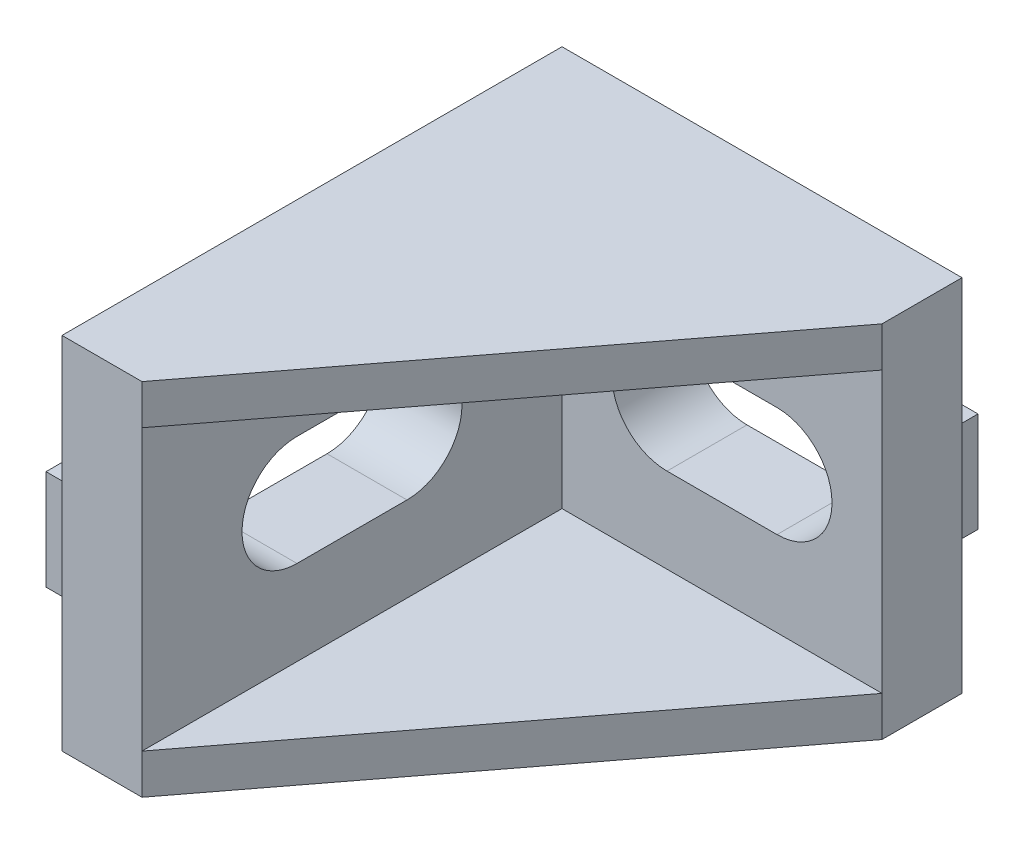
ISO-10303-21;
HEADER;
FILE_DESCRIPTION(('STEP AP214'),'2;1');
FILE_NAME('part.step','',(''),(''),'','','');
FILE_SCHEMA(('AUTOMOTIVE_DESIGN { 1 0 10303 214 1 1 1 1 }'));
ENDSEC;
DATA;
#1=APPLICATION_CONTEXT('core data for automotive mechanical design processes');
#2=APPLICATION_PROTOCOL_DEFINITION('international standard','automotive_design',2000,#1);
#3=PRODUCT_CONTEXT('',#1,'mechanical');
#4=PRODUCT('Part','Part','',(#3));
#5=PRODUCT_RELATED_PRODUCT_CATEGORY('part','',(#4));
#6=PRODUCT_DEFINITION_FORMATION('','',#4);
#7=PRODUCT_DEFINITION_CONTEXT('part definition',#1,'design');
#8=PRODUCT_DEFINITION('design','',#6,#7);
#9=PRODUCT_DEFINITION_SHAPE('','',#8);
#10=(LENGTH_UNIT() NAMED_UNIT(*) SI_UNIT(.MILLI.,.METRE.));
#11=(NAMED_UNIT(*) PLANE_ANGLE_UNIT() SI_UNIT($,.RADIAN.));
#12=(NAMED_UNIT(*) SI_UNIT($,.STERADIAN.) SOLID_ANGLE_UNIT());
#13=UNCERTAINTY_MEASURE_WITH_UNIT(LENGTH_MEASURE(1.E-05),#10,'distance_accuracy_value','');
#14=(GEOMETRIC_REPRESENTATION_CONTEXT(3) GLOBAL_UNCERTAINTY_ASSIGNED_CONTEXT((#13)) GLOBAL_UNIT_ASSIGNED_CONTEXT((#10,
#11,#12)) REPRESENTATION_CONTEXT('',''));
#15=CARTESIAN_POINT('',(0.,0.,0.));
#16=DIRECTION('',(0.,0.,1.));
#17=DIRECTION('',(1.,0.,0.));
#18=AXIS2_PLACEMENT_3D('',#15,#16,#17);
#19=CARTESIAN_POINT('',(-10.,9.,25.));
#20=DIRECTION('',(1.,0.,0.));
#21=DIRECTION('',(0.,0.,-1.));
#22=AXIS2_PLACEMENT_3D('',#19,#20,#21);
#23=PLANE('',#22);
#24=DIRECTION('',(0.,-1.,0.));
#25=VECTOR('',#24,1.);
#26=CARTESIAN_POINT('',(-10.,2.5,0.200000000000001));
#27=LINE('',#26,#25);
#28=CARTESIAN_POINT('',(-10.,2.5,0.200000000000001));
#29=VERTEX_POINT('',#28);
#30=CARTESIAN_POINT('',(-10.,-2.5,0.200000000000002));
#31=VERTEX_POINT('',#30);
#32=EDGE_CURVE('E254',#29,#31,#27,.T.);
#33=ORIENTED_EDGE('',*,*,#32,.F.);
#34=DIRECTION('',(0.,0.,-1.));
#35=VECTOR('',#34,1.);
#36=CARTESIAN_POINT('',(-10.,2.5,0.200000000000001));
#37=LINE('',#36,#35);
#38=CARTESIAN_POINT('',(-10.,2.5,2.2));
#39=VERTEX_POINT('',#38);
#40=EDGE_CURVE('E297',#39,#29,#37,.T.);
#41=ORIENTED_EDGE('',*,*,#40,.F.);
#42=DIRECTION('',(0.,1.,0.));
#43=VECTOR('',#42,1.);
#44=CARTESIAN_POINT('',(-10.,2.5,2.2));
#45=LINE('',#44,#43);
#46=CARTESIAN_POINT('',(-10.,-2.5,2.2));
#47=VERTEX_POINT('',#46);
#48=EDGE_CURVE('E314',#47,#39,#45,.T.);
#49=ORIENTED_EDGE('',*,*,#48,.F.);
#50=DIRECTION('',(0.,0.,1.));
#51=VECTOR('',#50,1.);
#52=CARTESIAN_POINT('',(-10.,-2.5,0.200000000000001));
#53=LINE('',#52,#51);
#54=EDGE_CURVE('E310',#31,#47,#53,.T.);
#55=ORIENTED_EDGE('',*,*,#54,.F.);
#56=EDGE_LOOP('',(#33,#41,#49,#55));
#57=FACE_BOUND('',#56,.T.);
#58=DIRECTION('',(0.,0.,1.));
#59=VECTOR('',#58,1.);
#60=CARTESIAN_POINT('',(-10.,2.75,17.25));
#61=LINE('',#60,#59);
#62=CARTESIAN_POINT('',(-10.,2.75,11.75));
#63=VERTEX_POINT('',#62);
#64=CARTESIAN_POINT('',(-10.,2.75,17.25));
#65=VERTEX_POINT('',#64);
#66=EDGE_CURVE('E440',#63,#65,#61,.T.);
#67=ORIENTED_EDGE('',*,*,#66,.T.);
#68=CARTESIAN_POINT('',(-10.,0.,17.25));
#69=DIRECTION('',(1.,0.,0.));
#70=DIRECTION('',(0.,1.,0.));
#71=AXIS2_PLACEMENT_3D('',#68,#69,#70);
#72=CIRCLE('',#71,2.75);
#73=CARTESIAN_POINT('',(-10.,-2.75,17.25));
#74=VERTEX_POINT('',#73);
#75=EDGE_CURVE('E427',#65,#74,#72,.T.);
#76=ORIENTED_EDGE('',*,*,#75,.T.);
#77=DIRECTION('',(0.,0.,-1.));
#78=VECTOR('',#77,1.);
#79=CARTESIAN_POINT('',(-10.,-2.75,17.25));
#80=LINE('',#79,#78);
#81=CARTESIAN_POINT('',(-10.,-2.75,11.75));
#82=VERTEX_POINT('',#81);
#83=EDGE_CURVE('E431',#74,#82,#80,.T.);
#84=ORIENTED_EDGE('',*,*,#83,.T.);
#85=CARTESIAN_POINT('',(-10.,0.,11.75));
#86=DIRECTION('',(1.,0.,0.));
#87=DIRECTION('',(0.,1.,0.));
#88=AXIS2_PLACEMENT_3D('',#85,#86,#87);
#89=CIRCLE('',#88,2.75);
#90=EDGE_CURVE('E436',#82,#63,#89,.T.);
#91=ORIENTED_EDGE('',*,*,#90,.T.);
#92=EDGE_LOOP('',(#67,#76,#84,#91));
#93=FACE_BOUND('',#92,.T.);
#94=DIRECTION('',(0.,-1.,0.));
#95=VECTOR('',#94,1.);
#96=CARTESIAN_POINT('',(-10.,9.,0.));
#97=LINE('',#96,#95);
#98=CARTESIAN_POINT('',(-10.,9.,0.));
#99=VERTEX_POINT('',#98);
#100=CARTESIAN_POINT('',(-10.,-9.,0.));
#101=VERTEX_POINT('',#100);
#102=EDGE_CURVE('E585',#99,#101,#97,.T.);
#103=ORIENTED_EDGE('',*,*,#102,.T.);
#104=DIRECTION('',(0.,0.,-1.));
#105=VECTOR('',#104,1.);
#106=CARTESIAN_POINT('',(-10.,-9.,25.));
#107=LINE('',#106,#105);
#108=CARTESIAN_POINT('',(-10.,-9.,25.));
#109=VERTEX_POINT('',#108);
#110=EDGE_CURVE('E593',#109,#101,#107,.T.);
#111=ORIENTED_EDGE('',*,*,#110,.F.);
#112=DIRECTION('',(0.,-1.,0.));
#113=VECTOR('',#112,1.);
#114=CARTESIAN_POINT('',(-10.,9.,25.));
#115=LINE('',#114,#113);
#116=CARTESIAN_POINT('',(-10.,9.,25.));
#117=VERTEX_POINT('',#116);
#118=EDGE_CURVE('E570',#117,#109,#115,.T.);
#119=ORIENTED_EDGE('',*,*,#118,.F.);
#120=DIRECTION('',(0.,0.,-1.));
#121=VECTOR('',#120,1.);
#122=CARTESIAN_POINT('',(-10.,9.,25.));
#123=LINE('',#122,#121);
#124=EDGE_CURVE('E51',#117,#99,#123,.T.);
#125=ORIENTED_EDGE('',*,*,#124,.T.);
#126=EDGE_LOOP('',(#103,#111,#119,#125));
#127=FACE_BOUND('',#126,.T.);
#128=DIRECTION('',(0.,-1.,0.));
#129=VECTOR('',#128,1.);
#130=CARTESIAN_POINT('',(-10.,2.5,22.8));
#131=LINE('',#130,#129);
#132=CARTESIAN_POINT('',(-10.,2.5,22.8));
#133=VERTEX_POINT('',#132);
#134=CARTESIAN_POINT('',(-10.,-2.5,22.8));
#135=VERTEX_POINT('',#134);
#136=EDGE_CURVE('E247',#133,#135,#131,.T.);
#137=ORIENTED_EDGE('',*,*,#136,.F.);
#138=DIRECTION('',(0.,0.,-1.));
#139=VECTOR('',#138,1.);
#140=CARTESIAN_POINT('',(-10.,2.5,22.8));
#141=LINE('',#140,#139);
#142=CARTESIAN_POINT('',(-10.,2.5,24.8));
#143=VERTEX_POINT('',#142);
#144=EDGE_CURVE('E249',#143,#133,#141,.T.);
#145=ORIENTED_EDGE('',*,*,#144,.F.);
#146=DIRECTION('',(0.,1.,0.));
#147=VECTOR('',#146,1.);
#148=CARTESIAN_POINT('',(-10.,2.5,24.8));
#149=LINE('',#148,#147);
#150=CARTESIAN_POINT('',(-10.,-2.5,24.8));
#151=VERTEX_POINT('',#150);
#152=EDGE_CURVE('E63',#151,#143,#149,.T.);
#153=ORIENTED_EDGE('',*,*,#152,.F.);
#154=DIRECTION('',(0.,0.,1.));
#155=VECTOR('',#154,1.);
#156=CARTESIAN_POINT('',(-10.,-2.5,22.8));
#157=LINE('',#156,#155);
#158=EDGE_CURVE('E58',#135,#151,#157,.T.);
#159=ORIENTED_EDGE('',*,*,#158,.F.);
#160=EDGE_LOOP('',(#137,#145,#153,#159));
#161=FACE_BOUND('',#160,.T.);
#162=ADVANCED_FACE('F42',(#57,#93,#127,#161),#23,.F.);
#163=CARTESIAN_POINT('',(0.,0.,0.));
#164=DIRECTION('',(0.,0.,1.));
#165=DIRECTION('',(1.,0.,0.));
#166=AXIS2_PLACEMENT_3D('',#163,#164,#165);
#167=PLANE('',#166);
#168=DIRECTION('',(0.,-1.,0.));
#169=VECTOR('',#168,1.);
#170=CARTESIAN_POINT('',(9.8,2.5,0.));
#171=LINE('',#170,#169);
#172=CARTESIAN_POINT('',(9.8,2.5,0.));
#173=VERTEX_POINT('',#172);
#174=CARTESIAN_POINT('',(9.8,-2.5,0.));
#175=VERTEX_POINT('',#174);
#176=EDGE_CURVE('E370',#173,#175,#171,.T.);
#177=ORIENTED_EDGE('',*,*,#176,.F.);
#178=DIRECTION('',(1.,0.,0.));
#179=VECTOR('',#178,1.);
#180=CARTESIAN_POINT('',(9.8,2.5,0.));
#181=LINE('',#180,#179);
#182=CARTESIAN_POINT('',(7.8,2.5,0.));
#183=VERTEX_POINT('',#182);
#184=EDGE_CURVE('E387',#183,#173,#181,.T.);
#185=ORIENTED_EDGE('',*,*,#184,.F.);
#186=DIRECTION('',(0.,1.,0.));
#187=VECTOR('',#186,1.);
#188=CARTESIAN_POINT('',(7.8,2.5,0.));
#189=LINE('',#188,#187);
#190=CARTESIAN_POINT('',(7.8,-2.5,0.));
#191=VERTEX_POINT('',#190);
#192=EDGE_CURVE('E404',#191,#183,#189,.T.);
#193=ORIENTED_EDGE('',*,*,#192,.F.);
#194=DIRECTION('',(-1.,0.,0.));
#195=VECTOR('',#194,1.);
#196=CARTESIAN_POINT('',(9.8,-2.5,0.));
#197=LINE('',#196,#195);
#198=EDGE_CURVE('E400',#175,#191,#197,.T.);
#199=ORIENTED_EDGE('',*,*,#198,.F.);
#200=EDGE_LOOP('',(#177,#185,#193,#199));
#201=FACE_BOUND('',#200,.T.);
#202=DIRECTION('',(-1.,0.,0.));
#203=VECTOR('',#202,1.);
#204=CARTESIAN_POINT('',(-0.749999999999998,2.75,0.));
#205=LINE('',#204,#203);
#206=CARTESIAN_POINT('',(4.75,2.75,0.));
#207=VERTEX_POINT('',#206);
#208=CARTESIAN_POINT('',(-0.749999999999998,2.75,0.));
#209=VERTEX_POINT('',#208);
#210=EDGE_CURVE('E484',#207,#209,#205,.T.);
#211=ORIENTED_EDGE('',*,*,#210,.T.);
#212=CARTESIAN_POINT('',(-0.749999999999998,0.,0.));
#213=DIRECTION('',(0.,0.,1.));
#214=DIRECTION('',(1.,0.,0.));
#215=AXIS2_PLACEMENT_3D('',#212,#213,#214);
#216=CIRCLE('',#215,2.75);
#217=CARTESIAN_POINT('',(-0.749999999999998,-2.75,0.));
#218=VERTEX_POINT('',#217);
#219=EDGE_CURVE('E471',#209,#218,#216,.T.);
#220=ORIENTED_EDGE('',*,*,#219,.T.);
#221=DIRECTION('',(1.,0.,0.));
#222=VECTOR('',#221,1.);
#223=CARTESIAN_POINT('',(-0.749999999999998,-2.75,0.));
#224=LINE('',#223,#222);
#225=CARTESIAN_POINT('',(4.75,-2.75,0.));
#226=VERTEX_POINT('',#225);
#227=EDGE_CURVE('E475',#218,#226,#224,.T.);
#228=ORIENTED_EDGE('',*,*,#227,.T.);
#229=CARTESIAN_POINT('',(4.75,0.,0.));
#230=DIRECTION('',(0.,0.,1.));
#231=DIRECTION('',(1.,0.,0.));
#232=AXIS2_PLACEMENT_3D('',#229,#230,#231);
#233=CIRCLE('',#232,2.75);
#234=EDGE_CURVE('E480',#226,#207,#233,.T.);
#235=ORIENTED_EDGE('',*,*,#234,.T.);
#236=EDGE_LOOP('',(#211,#220,#228,#235));
#237=FACE_BOUND('',#236,.T.);
#238=DIRECTION('',(0.,1.,0.));
#239=VECTOR('',#238,1.);
#240=CARTESIAN_POINT('',(10.,9.,0.));
#241=LINE('',#240,#239);
#242=CARTESIAN_POINT('',(10.,-9.,0.));
#243=VERTEX_POINT('',#242);
#244=CARTESIAN_POINT('',(10.,9.,0.));
#245=VERTEX_POINT('',#244);
#246=EDGE_CURVE('E563',#243,#245,#241,.T.);
#247=ORIENTED_EDGE('',*,*,#246,.F.);
#248=DIRECTION('',(1.,0.,0.));
#249=VECTOR('',#248,1.);
#250=CARTESIAN_POINT('',(-10.,-9.,0.));
#251=LINE('',#250,#249);
#252=EDGE_CURVE('E571',#101,#243,#251,.T.);
#253=ORIENTED_EDGE('',*,*,#252,.F.);
#254=ORIENTED_EDGE('',*,*,#102,.F.);
#255=DIRECTION('',(-1.,0.,0.));
#256=VECTOR('',#255,1.);
#257=CARTESIAN_POINT('',(-10.,9.,0.));
#258=LINE('',#257,#256);
#259=EDGE_CURVE('E582',#245,#99,#258,.T.);
#260=ORIENTED_EDGE('',*,*,#259,.F.);
#261=EDGE_LOOP('',(#247,#253,#254,#260));
#262=FACE_BOUND('',#261,.T.);
#263=DIRECTION('',(0.,1.,0.));
#264=VECTOR('',#263,1.);
#265=CARTESIAN_POINT('',(-9.8,2.5,0.));
#266=LINE('',#265,#264);
#267=CARTESIAN_POINT('',(-9.8,-2.5,0.));
#268=VERTEX_POINT('',#267);
#269=CARTESIAN_POINT('',(-9.8,2.5,0.));
#270=VERTEX_POINT('',#269);
#271=EDGE_CURVE('E366',#268,#270,#266,.T.);
#272=ORIENTED_EDGE('',*,*,#271,.F.);
#273=DIRECTION('',(-1.,0.,0.));
#274=VECTOR('',#273,1.);
#275=CARTESIAN_POINT('',(-9.8,-2.5,0.));
#276=LINE('',#275,#274);
#277=CARTESIAN_POINT('',(-7.8,-2.5,0.));
#278=VERTEX_POINT('',#277);
#279=EDGE_CURVE('E353',#278,#268,#276,.T.);
#280=ORIENTED_EDGE('',*,*,#279,.F.);
#281=DIRECTION('',(0.,-1.,0.));
#282=VECTOR('',#281,1.);
#283=CARTESIAN_POINT('',(-7.8,2.5,0.));
#284=LINE('',#283,#282);
#285=CARTESIAN_POINT('',(-7.8,2.5,0.));
#286=VERTEX_POINT('',#285);
#287=EDGE_CURVE('E357',#286,#278,#284,.T.);
#288=ORIENTED_EDGE('',*,*,#287,.F.);
#289=DIRECTION('',(1.,0.,0.));
#290=VECTOR('',#289,1.);
#291=CARTESIAN_POINT('',(-9.8,2.5,0.));
#292=LINE('',#291,#290);
#293=EDGE_CURVE('E362',#270,#286,#292,.T.);
#294=ORIENTED_EDGE('',*,*,#293,.F.);
#295=EDGE_LOOP('',(#272,#280,#288,#294));
#296=FACE_BOUND('',#295,.T.);
#297=ADVANCED_FACE('F609',(#201,#237,#262,#296),#167,.F.);
#298=CARTESIAN_POINT('',(10.,9.,25.));
#299=DIRECTION('',(-1.,0.,0.));
#300=DIRECTION('',(0.,0.,1.));
#301=AXIS2_PLACEMENT_3D('',#298,#299,#300);
#302=PLANE('',#301);
#303=DIRECTION('',(0.,0.,-1.));
#304=VECTOR('',#303,1.);
#305=CARTESIAN_POINT('',(10.,9.,25.));
#306=LINE('',#305,#304);
#307=CARTESIAN_POINT('',(10.,9.,4.));
#308=VERTEX_POINT('',#307);
#309=EDGE_CURVE('E11',#308,#245,#306,.T.);
#310=ORIENTED_EDGE('',*,*,#309,.F.);
#311=DIRECTION('',(0.,1.,0.));
#312=VECTOR('',#311,1.);
#313=CARTESIAN_POINT('',(10.,-9.,4.));
#314=LINE('',#313,#312);
#315=CARTESIAN_POINT('',(10.,7.,4.));
#316=VERTEX_POINT('',#315);
#317=EDGE_CURVE('E521',#316,#308,#314,.T.);
#318=ORIENTED_EDGE('',*,*,#317,.F.);
#319=DIRECTION('',(0.,1.,0.));
#320=VECTOR('',#319,1.);
#321=CARTESIAN_POINT('',(10.,7.,4.));
#322=LINE('',#321,#320);
#323=CARTESIAN_POINT('',(10.,-7.,4.));
#324=VERTEX_POINT('',#323);
#325=EDGE_CURVE('E539',#324,#316,#322,.T.);
#326=ORIENTED_EDGE('',*,*,#325,.F.);
#327=CARTESIAN_POINT('',(10.,-9.,4.));
#328=VERTEX_POINT('',#327);
#329=EDGE_CURVE('E528',#328,#324,#314,.T.);
#330=ORIENTED_EDGE('',*,*,#329,.F.);
#331=DIRECTION('',(0.,0.,-1.));
#332=VECTOR('',#331,1.);
#333=CARTESIAN_POINT('',(10.,-9.,25.));
#334=LINE('',#333,#332);
#335=EDGE_CURVE('E578',#328,#243,#334,.T.);
#336=ORIENTED_EDGE('',*,*,#335,.T.);
#337=ORIENTED_EDGE('',*,*,#246,.T.);
#338=EDGE_LOOP('',(#310,#318,#326,#330,#336,#337));
#339=FACE_BOUND('',#338,.T.);
#340=ADVANCED_FACE('F44',(#339),#302,.F.);
#341=CARTESIAN_POINT('',(-10.,9.,25.));
#342=DIRECTION('',(0.,-1.,0.));
#343=DIRECTION('',(0.,0.,-1.));
#344=AXIS2_PLACEMENT_3D('',#341,#342,#343);
#345=PLANE('',#344);
#346=DIRECTION('',(-1.,0.,0.));
#347=VECTOR('',#346,1.);
#348=CARTESIAN_POINT('',(-10.,9.,25.));
#349=LINE('',#348,#347);
#350=CARTESIAN_POINT('',(-6.,9.,25.));
#351=VERTEX_POINT('',#350);
#352=EDGE_CURVE('E567',#351,#117,#349,.T.);
#353=ORIENTED_EDGE('',*,*,#352,.F.);
#354=DIRECTION('',(-0.606043215262856,0.,0.795431720032499));
#355=VECTOR('',#354,1.);
#356=CARTESIAN_POINT('',(-6.,9.,25.));
#357=LINE('',#356,#355);
#358=EDGE_CURVE('E505',#308,#351,#357,.T.);
#359=ORIENTED_EDGE('',*,*,#358,.F.);
#360=ORIENTED_EDGE('',*,*,#309,.T.);
#361=ORIENTED_EDGE('',*,*,#259,.T.);
#362=ORIENTED_EDGE('',*,*,#124,.F.);
#363=EDGE_LOOP('',(#353,#359,#360,#361,#362));
#364=FACE_BOUND('',#363,.T.);
#365=ADVANCED_FACE('F620',(#364),#345,.F.);
#366=CARTESIAN_POINT('',(-10.,-9.,25.));
#367=DIRECTION('',(0.,1.,0.));
#368=DIRECTION('',(0.,0.,1.));
#369=AXIS2_PLACEMENT_3D('',#366,#367,#368);
#370=PLANE('',#369);
#371=ORIENTED_EDGE('',*,*,#335,.F.);
#372=DIRECTION('',(-0.606043215262856,0.,0.795431720032499));
#373=VECTOR('',#372,1.);
#374=CARTESIAN_POINT('',(-6.,-9.,25.));
#375=LINE('',#374,#373);
#376=CARTESIAN_POINT('',(-6.,-9.,25.));
#377=VERTEX_POINT('',#376);
#378=EDGE_CURVE('E517',#328,#377,#375,.T.);
#379=ORIENTED_EDGE('',*,*,#378,.T.);
#380=DIRECTION('',(1.,0.,0.));
#381=VECTOR('',#380,1.);
#382=CARTESIAN_POINT('',(-10.,-9.,25.));
#383=LINE('',#382,#381);
#384=EDGE_CURVE('E574',#109,#377,#383,.T.);
#385=ORIENTED_EDGE('',*,*,#384,.F.);
#386=ORIENTED_EDGE('',*,*,#110,.T.);
#387=ORIENTED_EDGE('',*,*,#252,.T.);
#388=EDGE_LOOP('',(#371,#379,#385,#386,#387));
#389=FACE_BOUND('',#388,.T.);
#390=ADVANCED_FACE('F613',(#389),#370,.F.);
#391=CARTESIAN_POINT('',(0.,0.,25.));
#392=DIRECTION('',(0.,0.,1.));
#393=DIRECTION('',(1.,0.,0.));
#394=AXIS2_PLACEMENT_3D('',#391,#392,#393);
#395=PLANE('',#394);
#396=DIRECTION('',(0.,1.,0.));
#397=VECTOR('',#396,1.);
#398=CARTESIAN_POINT('',(-6.,-9.,25.));
#399=LINE('',#398,#397);
#400=CARTESIAN_POINT('',(-6.,7.,25.));
#401=VERTEX_POINT('',#400);
#402=EDGE_CURVE('E527',#401,#351,#399,.T.);
#403=ORIENTED_EDGE('',*,*,#402,.T.);
#404=ORIENTED_EDGE('',*,*,#352,.T.);
#405=ORIENTED_EDGE('',*,*,#118,.T.);
#406=ORIENTED_EDGE('',*,*,#384,.T.);
#407=CARTESIAN_POINT('',(-6.,-7.,25.));
#408=VERTEX_POINT('',#407);
#409=EDGE_CURVE('E522',#377,#408,#399,.T.);
#410=ORIENTED_EDGE('',*,*,#409,.T.);
#411=DIRECTION('',(0.,-1.,0.));
#412=VECTOR('',#411,1.);
#413=CARTESIAN_POINT('',(-6.,7.,25.));
#414=LINE('',#413,#412);
#415=EDGE_CURVE('E538',#401,#408,#414,.T.);
#416=ORIENTED_EDGE('',*,*,#415,.F.);
#417=EDGE_LOOP('',(#403,#404,#405,#406,#410,#416));
#418=FACE_BOUND('',#417,.T.);
#419=ADVANCED_FACE('F617',(#418),#395,.T.);
#420=CARTESIAN_POINT('',(10.,-7.,4.));
#421=DIRECTION('',(0.,-1.,0.));
#422=DIRECTION('',(1.,0.,0.));
#423=AXIS2_PLACEMENT_3D('',#420,#421,#422);
#424=PLANE('',#423);
#425=DIRECTION('',(0.,0.,1.));
#426=VECTOR('',#425,1.);
#427=CARTESIAN_POINT('',(-6.,-7.,4.));
#428=LINE('',#427,#426);
#429=CARTESIAN_POINT('',(-6.,-7.,4.));
#430=VERTEX_POINT('',#429);
#431=EDGE_CURVE('E559',#430,#408,#428,.T.);
#432=ORIENTED_EDGE('',*,*,#431,.T.);
#433=DIRECTION('',(0.606043215262856,0.,-0.795431720032499));
#434=VECTOR('',#433,1.);
#435=CARTESIAN_POINT('',(10.,-7.,4.));
#436=LINE('',#435,#434);
#437=EDGE_CURVE('E534',#408,#324,#436,.T.);
#438=ORIENTED_EDGE('',*,*,#437,.T.);
#439=DIRECTION('',(1.,0.,0.));
#440=VECTOR('',#439,1.);
#441=CARTESIAN_POINT('',(10.,-7.,4.));
#442=LINE('',#441,#440);
#443=EDGE_CURVE('E551',#430,#324,#442,.T.);
#444=ORIENTED_EDGE('',*,*,#443,.F.);
#445=EDGE_LOOP('',(#432,#438,#444));
#446=FACE_BOUND('',#445,.T.);
#447=ADVANCED_FACE('F632',(#446),#424,.F.);
#448=CARTESIAN_POINT('',(-6.,7.,4.));
#449=DIRECTION('',(-1.,0.,0.));
#450=DIRECTION('',(0.,-1.,0.));
#451=AXIS2_PLACEMENT_3D('',#448,#449,#450);
#452=PLANE('',#451);
#453=DIRECTION('',(0.,0.,-1.));
#454=VECTOR('',#453,1.);
#455=CARTESIAN_POINT('',(-6.,-2.75,17.25));
#456=LINE('',#455,#454);
#457=CARTESIAN_POINT('',(-6.,-2.75,17.25));
#458=VERTEX_POINT('',#457);
#459=CARTESIAN_POINT('',(-6.,-2.75,11.75));
#460=VERTEX_POINT('',#459);
#461=EDGE_CURVE('E447',#458,#460,#456,.T.);
#462=ORIENTED_EDGE('',*,*,#461,.F.);
#463=CARTESIAN_POINT('',(-6.,0.,17.25));
#464=DIRECTION('',(1.,0.,0.));
#465=DIRECTION('',(0.,1.,0.));
#466=AXIS2_PLACEMENT_3D('',#463,#464,#465);
#467=CIRCLE('',#466,2.75);
#468=CARTESIAN_POINT('',(-6.,2.75,17.25));
#469=VERTEX_POINT('',#468);
#470=EDGE_CURVE('E426',#469,#458,#467,.T.);
#471=ORIENTED_EDGE('',*,*,#470,.F.);
#472=DIRECTION('',(0.,0.,1.));
#473=VECTOR('',#472,1.);
#474=CARTESIAN_POINT('',(-6.,2.75,17.25));
#475=LINE('',#474,#473);
#476=CARTESIAN_POINT('',(-6.,2.75,11.75));
#477=VERTEX_POINT('',#476);
#478=EDGE_CURVE('E432',#477,#469,#475,.T.);
#479=ORIENTED_EDGE('',*,*,#478,.F.);
#480=CARTESIAN_POINT('',(-6.,0.,11.75));
#481=DIRECTION('',(1.,0.,0.));
#482=DIRECTION('',(0.,1.,0.));
#483=AXIS2_PLACEMENT_3D('',#480,#481,#482);
#484=CIRCLE('',#483,2.75);
#485=EDGE_CURVE('E451',#460,#477,#484,.T.);
#486=ORIENTED_EDGE('',*,*,#485,.F.);
#487=EDGE_LOOP('',(#462,#471,#479,#486));
#488=FACE_BOUND('',#487,.T.);
#489=ORIENTED_EDGE('',*,*,#415,.T.);
#490=ORIENTED_EDGE('',*,*,#431,.F.);
#491=DIRECTION('',(0.,-1.,0.));
#492=VECTOR('',#491,1.);
#493=CARTESIAN_POINT('',(-6.,7.,4.));
#494=LINE('',#493,#492);
#495=CARTESIAN_POINT('',(-6.,7.,4.));
#496=VERTEX_POINT('',#495);
#497=EDGE_CURVE('E547',#496,#430,#494,.T.);
#498=ORIENTED_EDGE('',*,*,#497,.F.);
#499=DIRECTION('',(0.,0.,1.));
#500=VECTOR('',#499,1.);
#501=CARTESIAN_POINT('',(-6.,7.,4.));
#502=LINE('',#501,#500);
#503=EDGE_CURVE('E555',#496,#401,#502,.T.);
#504=ORIENTED_EDGE('',*,*,#503,.T.);
#505=EDGE_LOOP('',(#489,#490,#498,#504));
#506=FACE_BOUND('',#505,.T.);
#507=ADVANCED_FACE('F637',(#488,#506),#452,.F.);
#508=CARTESIAN_POINT('',(10.,7.,4.));
#509=DIRECTION('',(0.,1.,0.));
#510=DIRECTION('',(-1.,0.,0.));
#511=AXIS2_PLACEMENT_3D('',#508,#509,#510);
#512=PLANE('',#511);
#513=DIRECTION('',(-1.,0.,0.));
#514=VECTOR('',#513,1.);
#515=CARTESIAN_POINT('',(10.,7.,4.));
#516=LINE('',#515,#514);
#517=EDGE_CURVE('E543',#316,#496,#516,.T.);
#518=ORIENTED_EDGE('',*,*,#517,.F.);
#519=DIRECTION('',(-0.606043215262856,0.,0.795431720032499));
#520=VECTOR('',#519,1.);
#521=CARTESIAN_POINT('',(10.,7.,4.));
#522=LINE('',#521,#520);
#523=EDGE_CURVE('E526',#316,#401,#522,.T.);
#524=ORIENTED_EDGE('',*,*,#523,.T.);
#525=ORIENTED_EDGE('',*,*,#503,.F.);
#526=EDGE_LOOP('',(#518,#524,#525));
#527=FACE_BOUND('',#526,.T.);
#528=ADVANCED_FACE('F639',(#527),#512,.F.);
#529=CARTESIAN_POINT('',(0.,0.,4.));
#530=DIRECTION('',(0.,0.,-1.));
#531=DIRECTION('',(-1.,0.,0.));
#532=AXIS2_PLACEMENT_3D('',#529,#530,#531);
#533=PLANE('',#532);
#534=DIRECTION('',(1.,0.,0.));
#535=VECTOR('',#534,1.);
#536=CARTESIAN_POINT('',(-0.749999999999998,-2.75,4.));
#537=LINE('',#536,#535);
#538=CARTESIAN_POINT('',(-0.749999999999998,-2.75,4.));
#539=VERTEX_POINT('',#538);
#540=CARTESIAN_POINT('',(4.75,-2.75,4.));
#541=VERTEX_POINT('',#540);
#542=EDGE_CURVE('E491',#539,#541,#537,.T.);
#543=ORIENTED_EDGE('',*,*,#542,.F.);
#544=CARTESIAN_POINT('',(-0.749999999999998,0.,4.));
#545=DIRECTION('',(0.,0.,1.));
#546=DIRECTION('',(1.,0.,0.));
#547=AXIS2_PLACEMENT_3D('',#544,#545,#546);
#548=CIRCLE('',#547,2.75);
#549=CARTESIAN_POINT('',(-0.749999999999998,2.75,4.));
#550=VERTEX_POINT('',#549);
#551=EDGE_CURVE('E461',#550,#539,#548,.T.);
#552=ORIENTED_EDGE('',*,*,#551,.F.);
#553=DIRECTION('',(-1.,0.,0.));
#554=VECTOR('',#553,1.);
#555=CARTESIAN_POINT('',(-0.749999999999998,2.75,4.));
#556=LINE('',#555,#554);
#557=CARTESIAN_POINT('',(4.75,2.75,4.));
#558=VERTEX_POINT('',#557);
#559=EDGE_CURVE('E476',#558,#550,#556,.T.);
#560=ORIENTED_EDGE('',*,*,#559,.F.);
#561=CARTESIAN_POINT('',(4.75,0.,4.));
#562=DIRECTION('',(0.,0.,1.));
#563=DIRECTION('',(1.,0.,0.));
#564=AXIS2_PLACEMENT_3D('',#561,#562,#563);
#565=CIRCLE('',#564,2.75);
#566=EDGE_CURVE('E495',#541,#558,#565,.T.);
#567=ORIENTED_EDGE('',*,*,#566,.F.);
#568=EDGE_LOOP('',(#543,#552,#560,#567));
#569=FACE_BOUND('',#568,.T.);
#570=ORIENTED_EDGE('',*,*,#325,.T.);
#571=ORIENTED_EDGE('',*,*,#517,.T.);
#572=ORIENTED_EDGE('',*,*,#497,.T.);
#573=ORIENTED_EDGE('',*,*,#443,.T.);
#574=EDGE_LOOP('',(#570,#571,#572,#573));
#575=FACE_BOUND('',#574,.T.);
#576=ADVANCED_FACE('F634',(#569,#575),#533,.F.);
#577=CARTESIAN_POINT('',(-6.,-9.,25.));
#578=DIRECTION('',(-0.795431720032499,0.,-0.606043215262856));
#579=DIRECTION('',(-0.606043215262856,0.,0.795431720032499));
#580=AXIS2_PLACEMENT_3D('',#577,#578,#579);
#581=PLANE('',#580);
#582=ORIENTED_EDGE('',*,*,#317,.T.);
#583=ORIENTED_EDGE('',*,*,#358,.T.);
#584=ORIENTED_EDGE('',*,*,#402,.F.);
#585=ORIENTED_EDGE('',*,*,#523,.F.);
#586=EDGE_LOOP('',(#582,#583,#584,#585));
#587=FACE_BOUND('',#586,.T.);
#588=ADVANCED_FACE('F640',(#587),#581,.F.);
#589=ORIENTED_EDGE('',*,*,#409,.F.);
#590=ORIENTED_EDGE('',*,*,#378,.F.);
#591=ORIENTED_EDGE('',*,*,#329,.T.);
#592=ORIENTED_EDGE('',*,*,#437,.F.);
#593=EDGE_LOOP('',(#589,#590,#591,#592));
#594=FACE_BOUND('',#593,.T.);
#595=ADVANCED_FACE('F629',(#594),#581,.F.);
#596=CARTESIAN_POINT('',(-0.749999999999998,0.,0.));
#597=DIRECTION('',(0.,0.,1.));
#598=DIRECTION('',(1.,0.,0.));
#599=AXIS2_PLACEMENT_3D('',#596,#597,#598);
#600=CYLINDRICAL_SURFACE('',#599,2.75);
#601=ORIENTED_EDGE('',*,*,#551,.T.);
#602=DIRECTION('',(0.,0.,1.));
#603=VECTOR('',#602,1.);
#604=CARTESIAN_POINT('',(-0.749999999999998,-2.75,0.));
#605=LINE('',#604,#603);
#606=EDGE_CURVE('E488',#218,#539,#605,.T.);
#607=ORIENTED_EDGE('',*,*,#606,.F.);
#608=ORIENTED_EDGE('',*,*,#219,.F.);
#609=DIRECTION('',(0.,0.,1.));
#610=VECTOR('',#609,1.);
#611=CARTESIAN_POINT('',(-0.749999999999998,2.75,0.));
#612=LINE('',#611,#610);
#613=EDGE_CURVE('E502',#209,#550,#612,.T.);
#614=ORIENTED_EDGE('',*,*,#613,.T.);
#615=EDGE_LOOP('',(#601,#607,#608,#614));
#616=FACE_BOUND('',#615,.T.);
#617=ADVANCED_FACE('F649',(#616),#600,.F.);
#618=CARTESIAN_POINT('',(-0.749999999999998,2.75,0.));
#619=DIRECTION('',(0.,1.,0.));
#620=DIRECTION('',(-1.,0.,0.));
#621=AXIS2_PLACEMENT_3D('',#618,#619,#620);
#622=PLANE('',#621);
#623=ORIENTED_EDGE('',*,*,#559,.T.);
#624=ORIENTED_EDGE('',*,*,#613,.F.);
#625=ORIENTED_EDGE('',*,*,#210,.F.);
#626=DIRECTION('',(0.,0.,1.));
#627=VECTOR('',#626,1.);
#628=CARTESIAN_POINT('',(4.75,2.75,0.));
#629=LINE('',#628,#627);
#630=EDGE_CURVE('E506',#207,#558,#629,.T.);
#631=ORIENTED_EDGE('',*,*,#630,.T.);
#632=EDGE_LOOP('',(#623,#624,#625,#631));
#633=FACE_BOUND('',#632,.T.);
#634=ADVANCED_FACE('F979',(#633),#622,.F.);
#635=CARTESIAN_POINT('',(4.75,0.,0.));
#636=DIRECTION('',(0.,0.,1.));
#637=DIRECTION('',(1.,0.,0.));
#638=AXIS2_PLACEMENT_3D('',#635,#636,#637);
#639=CYLINDRICAL_SURFACE('',#638,2.75);
#640=ORIENTED_EDGE('',*,*,#566,.T.);
#641=ORIENTED_EDGE('',*,*,#630,.F.);
#642=ORIENTED_EDGE('',*,*,#234,.F.);
#643=DIRECTION('',(0.,0.,1.));
#644=VECTOR('',#643,1.);
#645=CARTESIAN_POINT('',(4.75,-2.75,0.));
#646=LINE('',#645,#644);
#647=EDGE_CURVE('E509',#226,#541,#646,.T.);
#648=ORIENTED_EDGE('',*,*,#647,.T.);
#649=EDGE_LOOP('',(#640,#641,#642,#648));
#650=FACE_BOUND('',#649,.T.);
#651=ADVANCED_FACE('F969',(#650),#639,.F.);
#652=CARTESIAN_POINT('',(-0.749999999999998,-2.75,0.));
#653=DIRECTION('',(0.,-1.,0.));
#654=DIRECTION('',(1.,0.,0.));
#655=AXIS2_PLACEMENT_3D('',#652,#653,#654);
#656=PLANE('',#655);
#657=ORIENTED_EDGE('',*,*,#542,.T.);
#658=ORIENTED_EDGE('',*,*,#647,.F.);
#659=ORIENTED_EDGE('',*,*,#227,.F.);
#660=ORIENTED_EDGE('',*,*,#606,.T.);
#661=EDGE_LOOP('',(#657,#658,#659,#660));
#662=FACE_BOUND('',#661,.T.);
#663=ADVANCED_FACE('F959',(#662),#656,.F.);
#664=CARTESIAN_POINT('',(-10.,0.,17.25));
#665=DIRECTION('',(1.,0.,0.));
#666=DIRECTION('',(0.,1.,0.));
#667=AXIS2_PLACEMENT_3D('',#664,#665,#666);
#668=CYLINDRICAL_SURFACE('',#667,2.75);
#669=ORIENTED_EDGE('',*,*,#470,.T.);
#670=DIRECTION('',(1.,0.,0.));
#671=VECTOR('',#670,1.);
#672=CARTESIAN_POINT('',(-10.,-2.75,17.25));
#673=LINE('',#672,#671);
#674=EDGE_CURVE('E444',#74,#458,#673,.T.);
#675=ORIENTED_EDGE('',*,*,#674,.F.);
#676=ORIENTED_EDGE('',*,*,#75,.F.);
#677=DIRECTION('',(1.,0.,0.));
#678=VECTOR('',#677,1.);
#679=CARTESIAN_POINT('',(-10.,2.75,17.25));
#680=LINE('',#679,#678);
#681=EDGE_CURVE('E458',#65,#469,#680,.T.);
#682=ORIENTED_EDGE('',*,*,#681,.T.);
#683=EDGE_LOOP('',(#669,#675,#676,#682));
#684=FACE_BOUND('',#683,.T.);
#685=ADVANCED_FACE('F949',(#684),#668,.F.);
#686=CARTESIAN_POINT('',(-10.,2.75,17.25));
#687=DIRECTION('',(0.,1.,0.));
#688=DIRECTION('',(0.,0.,1.));
#689=AXIS2_PLACEMENT_3D('',#686,#687,#688);
#690=PLANE('',#689);
#691=ORIENTED_EDGE('',*,*,#478,.T.);
#692=ORIENTED_EDGE('',*,*,#681,.F.);
#693=ORIENTED_EDGE('',*,*,#66,.F.);
#694=DIRECTION('',(1.,0.,0.));
#695=VECTOR('',#694,1.);
#696=CARTESIAN_POINT('',(-10.,2.75,11.75));
#697=LINE('',#696,#695);
#698=EDGE_CURVE('E462',#63,#477,#697,.T.);
#699=ORIENTED_EDGE('',*,*,#698,.T.);
#700=EDGE_LOOP('',(#691,#692,#693,#699));
#701=FACE_BOUND('',#700,.T.);
#702=ADVANCED_FACE('F940',(#701),#690,.F.);
#703=CARTESIAN_POINT('',(-10.,0.,11.75));
#704=DIRECTION('',(1.,0.,0.));
#705=DIRECTION('',(0.,1.,0.));
#706=AXIS2_PLACEMENT_3D('',#703,#704,#705);
#707=CYLINDRICAL_SURFACE('',#706,2.75);
#708=ORIENTED_EDGE('',*,*,#485,.T.);
#709=ORIENTED_EDGE('',*,*,#698,.F.);
#710=ORIENTED_EDGE('',*,*,#90,.F.);
#711=DIRECTION('',(1.,0.,0.));
#712=VECTOR('',#711,1.);
#713=CARTESIAN_POINT('',(-10.,-2.75,11.75));
#714=LINE('',#713,#712);
#715=EDGE_CURVE('E465',#82,#460,#714,.T.);
#716=ORIENTED_EDGE('',*,*,#715,.T.);
#717=EDGE_LOOP('',(#708,#709,#710,#716));
#718=FACE_BOUND('',#717,.T.);
#719=ADVANCED_FACE('F931',(#718),#707,.F.);
#720=CARTESIAN_POINT('',(-10.,-2.75,17.25));
#721=DIRECTION('',(0.,-1.,0.));
#722=DIRECTION('',(0.,0.,-1.));
#723=AXIS2_PLACEMENT_3D('',#720,#721,#722);
#724=PLANE('',#723);
#725=ORIENTED_EDGE('',*,*,#461,.T.);
#726=ORIENTED_EDGE('',*,*,#715,.F.);
#727=ORIENTED_EDGE('',*,*,#83,.F.);
#728=ORIENTED_EDGE('',*,*,#674,.T.);
#729=EDGE_LOOP('',(#725,#726,#727,#728));
#730=FACE_BOUND('',#729,.T.);
#731=ADVANCED_FACE('F683',(#730),#724,.F.);
#732=CARTESIAN_POINT('',(9.8,2.5,-1.));
#733=DIRECTION('',(-1.,0.,0.));
#734=DIRECTION('',(0.,-1.,0.));
#735=AXIS2_PLACEMENT_3D('',#732,#733,#734);
#736=PLANE('',#735);
#737=ORIENTED_EDGE('',*,*,#176,.T.);
#738=DIRECTION('',(0.,0.,1.));
#739=VECTOR('',#738,1.);
#740=CARTESIAN_POINT('',(9.8,-2.5,-1.));
#741=LINE('',#740,#739);
#742=CARTESIAN_POINT('',(9.8,-2.5,-1.));
#743=VERTEX_POINT('',#742);
#744=EDGE_CURVE('E422',#743,#175,#741,.T.);
#745=ORIENTED_EDGE('',*,*,#744,.F.);
#746=DIRECTION('',(0.,-1.,0.));
#747=VECTOR('',#746,1.);
#748=CARTESIAN_POINT('',(9.8,2.5,-1.));
#749=LINE('',#748,#747);
#750=CARTESIAN_POINT('',(9.8,2.5,-1.));
#751=VERTEX_POINT('',#750);
#752=EDGE_CURVE('E382',#751,#743,#749,.T.);
#753=ORIENTED_EDGE('',*,*,#752,.F.);
#754=DIRECTION('',(0.,0.,1.));
#755=VECTOR('',#754,1.);
#756=CARTESIAN_POINT('',(9.8,2.5,-1.));
#757=LINE('',#756,#755);
#758=EDGE_CURVE('E396',#751,#173,#757,.T.);
#759=ORIENTED_EDGE('',*,*,#758,.T.);
#760=EDGE_LOOP('',(#737,#745,#753,#759));
#761=FACE_BOUND('',#760,.T.);
#762=ADVANCED_FACE('F687',(#761),#736,.F.);
#763=CARTESIAN_POINT('',(9.8,-2.5,-1.));
#764=DIRECTION('',(0.,1.,0.));
#765=DIRECTION('',(0.,0.,1.));
#766=AXIS2_PLACEMENT_3D('',#763,#764,#765);
#767=PLANE('',#766);
#768=ORIENTED_EDGE('',*,*,#198,.T.);
#769=DIRECTION('',(0.,0.,1.));
#770=VECTOR('',#769,1.);
#771=CARTESIAN_POINT('',(7.8,-2.5,-1.));
#772=LINE('',#771,#770);
#773=CARTESIAN_POINT('',(7.8,-2.5,-1.));
#774=VERTEX_POINT('',#773);
#775=EDGE_CURVE('E418',#774,#191,#772,.T.);
#776=ORIENTED_EDGE('',*,*,#775,.F.);
#777=DIRECTION('',(-1.,0.,0.));
#778=VECTOR('',#777,1.);
#779=CARTESIAN_POINT('',(9.8,-2.5,-1.));
#780=LINE('',#779,#778);
#781=EDGE_CURVE('E386',#743,#774,#780,.T.);
#782=ORIENTED_EDGE('',*,*,#781,.F.);
#783=ORIENTED_EDGE('',*,*,#744,.T.);
#784=EDGE_LOOP('',(#768,#776,#782,#783));
#785=FACE_BOUND('',#784,.T.);
#786=ADVANCED_FACE('F691',(#785),#767,.F.);
#787=CARTESIAN_POINT('',(7.8,2.5,-1.));
#788=DIRECTION('',(1.,0.,0.));
#789=DIRECTION('',(0.,1.,0.));
#790=AXIS2_PLACEMENT_3D('',#787,#788,#789);
#791=PLANE('',#790);
#792=ORIENTED_EDGE('',*,*,#192,.T.);
#793=DIRECTION('',(0.,0.,1.));
#794=VECTOR('',#793,1.);
#795=CARTESIAN_POINT('',(7.8,2.5,-1.));
#796=LINE('',#795,#794);
#797=CARTESIAN_POINT('',(7.8,2.5,-1.));
#798=VERTEX_POINT('',#797);
#799=EDGE_CURVE('E414',#798,#183,#796,.T.);
#800=ORIENTED_EDGE('',*,*,#799,.F.);
#801=DIRECTION('',(0.,1.,0.));
#802=VECTOR('',#801,1.);
#803=CARTESIAN_POINT('',(7.8,2.5,-1.));
#804=LINE('',#803,#802);
#805=EDGE_CURVE('E390',#774,#798,#804,.T.);
#806=ORIENTED_EDGE('',*,*,#805,.F.);
#807=ORIENTED_EDGE('',*,*,#775,.T.);
#808=EDGE_LOOP('',(#792,#800,#806,#807));
#809=FACE_BOUND('',#808,.T.);
#810=ADVANCED_FACE('F702',(#809),#791,.F.);
#811=CARTESIAN_POINT('',(9.8,2.5,-1.));
#812=DIRECTION('',(0.,-1.,0.));
#813=DIRECTION('',(1.,0.,0.));
#814=AXIS2_PLACEMENT_3D('',#811,#812,#813);
#815=PLANE('',#814);
#816=ORIENTED_EDGE('',*,*,#184,.T.);
#817=ORIENTED_EDGE('',*,*,#758,.F.);
#818=DIRECTION('',(1.,0.,0.));
#819=VECTOR('',#818,1.);
#820=CARTESIAN_POINT('',(9.8,2.5,-1.));
#821=LINE('',#820,#819);
#822=EDGE_CURVE('E393',#798,#751,#821,.T.);
#823=ORIENTED_EDGE('',*,*,#822,.F.);
#824=ORIENTED_EDGE('',*,*,#799,.T.);
#825=EDGE_LOOP('',(#816,#817,#823,#824));
#826=FACE_BOUND('',#825,.T.);
#827=ADVANCED_FACE('F713',(#826),#815,.F.);
#828=CARTESIAN_POINT('',(0.,0.,-1.));
#829=DIRECTION('',(0.,0.,-1.));
#830=DIRECTION('',(-1.,0.,0.));
#831=AXIS2_PLACEMENT_3D('',#828,#829,#830);
#832=PLANE('',#831);
#833=ORIENTED_EDGE('',*,*,#752,.T.);
#834=ORIENTED_EDGE('',*,*,#781,.T.);
#835=ORIENTED_EDGE('',*,*,#805,.T.);
#836=ORIENTED_EDGE('',*,*,#822,.T.);
#837=EDGE_LOOP('',(#833,#834,#835,#836));
#838=FACE_BOUND('',#837,.T.);
#839=ADVANCED_FACE('F724',(#838),#832,.T.);
#840=CARTESIAN_POINT('',(-9.8,2.5,-1.));
#841=DIRECTION('',(1.,0.,0.));
#842=DIRECTION('',(0.,0.,-1.));
#843=AXIS2_PLACEMENT_3D('',#840,#841,#842);
#844=PLANE('',#843);
#845=ORIENTED_EDGE('',*,*,#271,.T.);
#846=DIRECTION('',(0.,0.,1.));
#847=VECTOR('',#846,1.);
#848=CARTESIAN_POINT('',(-9.8,2.5,-1.));
#849=LINE('',#848,#847);
#850=CARTESIAN_POINT('',(-9.8,2.5,-1.));
#851=VERTEX_POINT('',#850);
#852=EDGE_CURVE('E336',#851,#270,#849,.T.);
#853=ORIENTED_EDGE('',*,*,#852,.F.);
#854=DIRECTION('',(0.,1.,0.));
#855=VECTOR('',#854,1.);
#856=CARTESIAN_POINT('',(-9.8,2.5,-1.));
#857=LINE('',#856,#855);
#858=CARTESIAN_POINT('',(-9.8,-2.5,-1.));
#859=VERTEX_POINT('',#858);
#860=EDGE_CURVE('E358',#859,#851,#857,.T.);
#861=ORIENTED_EDGE('',*,*,#860,.F.);
#862=DIRECTION('',(0.,0.,1.));
#863=VECTOR('',#862,1.);
#864=CARTESIAN_POINT('',(-9.8,-2.5,-1.));
#865=LINE('',#864,#863);
#866=EDGE_CURVE('E348',#859,#268,#865,.T.);
#867=ORIENTED_EDGE('',*,*,#866,.T.);
#868=EDGE_LOOP('',(#845,#853,#861,#867));
#869=FACE_BOUND('',#868,.T.);
#870=ADVANCED_FACE('F735',(#869),#844,.F.);
#871=CARTESIAN_POINT('',(-9.8,2.5,-1.));
#872=DIRECTION('',(0.,-1.,0.));
#873=DIRECTION('',(1.,0.,0.));
#874=AXIS2_PLACEMENT_3D('',#871,#872,#873);
#875=PLANE('',#874);
#876=ORIENTED_EDGE('',*,*,#293,.T.);
#877=DIRECTION('',(0.,0.,1.));
#878=VECTOR('',#877,1.);
#879=CARTESIAN_POINT('',(-7.8,2.5,-1.));
#880=LINE('',#879,#878);
#881=CARTESIAN_POINT('',(-7.8,2.5,-1.));
#882=VERTEX_POINT('',#881);
#883=EDGE_CURVE('E340',#882,#286,#880,.T.);
#884=ORIENTED_EDGE('',*,*,#883,.F.);
#885=DIRECTION('',(1.,0.,0.));
#886=VECTOR('',#885,1.);
#887=CARTESIAN_POINT('',(-9.8,2.5,-1.));
#888=LINE('',#887,#886);
#889=EDGE_CURVE('E376',#851,#882,#888,.T.);
#890=ORIENTED_EDGE('',*,*,#889,.F.);
#891=ORIENTED_EDGE('',*,*,#852,.T.);
#892=EDGE_LOOP('',(#876,#884,#890,#891));
#893=FACE_BOUND('',#892,.T.);
#894=ADVANCED_FACE('F746',(#893),#875,.F.);
#895=CARTESIAN_POINT('',(-7.8,2.5,-1.));
#896=DIRECTION('',(-1.,0.,0.));
#897=DIRECTION('',(0.,-1.,0.));
#898=AXIS2_PLACEMENT_3D('',#895,#896,#897);
#899=PLANE('',#898);
#900=ORIENTED_EDGE('',*,*,#287,.T.);
#901=DIRECTION('',(0.,0.,1.));
#902=VECTOR('',#901,1.);
#903=CARTESIAN_POINT('',(-7.8,-2.5,-1.));
#904=LINE('',#903,#902);
#905=CARTESIAN_POINT('',(-7.8,-2.5,-1.));
#906=VERTEX_POINT('',#905);
#907=EDGE_CURVE('E344',#906,#278,#904,.T.);
#908=ORIENTED_EDGE('',*,*,#907,.F.);
#909=DIRECTION('',(0.,-1.,0.));
#910=VECTOR('',#909,1.);
#911=CARTESIAN_POINT('',(-7.8,2.5,-1.));
#912=LINE('',#911,#910);
#913=EDGE_CURVE('E373',#882,#906,#912,.T.);
#914=ORIENTED_EDGE('',*,*,#913,.F.);
#915=ORIENTED_EDGE('',*,*,#883,.T.);
#916=EDGE_LOOP('',(#900,#908,#914,#915));
#917=FACE_BOUND('',#916,.T.);
#918=ADVANCED_FACE('F757',(#917),#899,.F.);
#919=CARTESIAN_POINT('',(-9.8,-2.5,-1.));
#920=DIRECTION('',(0.,1.,0.));
#921=DIRECTION('',(-1.,0.,0.));
#922=AXIS2_PLACEMENT_3D('',#919,#920,#921);
#923=PLANE('',#922);
#924=ORIENTED_EDGE('',*,*,#279,.T.);
#925=ORIENTED_EDGE('',*,*,#866,.F.);
#926=DIRECTION('',(-1.,0.,0.));
#927=VECTOR('',#926,1.);
#928=CARTESIAN_POINT('',(-9.8,-2.5,-1.));
#929=LINE('',#928,#927);
#930=EDGE_CURVE('E352',#906,#859,#929,.T.);
#931=ORIENTED_EDGE('',*,*,#930,.F.);
#932=ORIENTED_EDGE('',*,*,#907,.T.);
#933=EDGE_LOOP('',(#924,#925,#931,#932));
#934=FACE_BOUND('',#933,.T.);
#935=ADVANCED_FACE('F768',(#934),#923,.F.);
#936=CARTESIAN_POINT('',(0.,0.,-1.));
#937=DIRECTION('',(0.,0.,1.));
#938=DIRECTION('',(1.,0.,0.));
#939=AXIS2_PLACEMENT_3D('',#936,#937,#938);
#940=PLANE('',#939);
#941=ORIENTED_EDGE('',*,*,#860,.T.);
#942=ORIENTED_EDGE('',*,*,#889,.T.);
#943=ORIENTED_EDGE('',*,*,#913,.T.);
#944=ORIENTED_EDGE('',*,*,#930,.T.);
#945=EDGE_LOOP('',(#941,#942,#943,#944));
#946=FACE_BOUND('',#945,.T.);
#947=ADVANCED_FACE('F779',(#946),#940,.F.);
#948=CARTESIAN_POINT('',(-11.,2.5,0.200000000000001));
#949=DIRECTION('',(0.,0.,1.));
#950=DIRECTION('',(1.,0.,0.));
#951=AXIS2_PLACEMENT_3D('',#948,#949,#950);
#952=PLANE('',#951);
#953=ORIENTED_EDGE('',*,*,#32,.T.);
#954=DIRECTION('',(1.,0.,0.));
#955=VECTOR('',#954,1.);
#956=CARTESIAN_POINT('',(-11.,-2.5,0.200000000000001));
#957=LINE('',#956,#955);
#958=CARTESIAN_POINT('',(-11.,-2.5,0.200000000000001));
#959=VERTEX_POINT('',#958);
#960=EDGE_CURVE('E332',#959,#31,#957,.T.);
#961=ORIENTED_EDGE('',*,*,#960,.F.);
#962=DIRECTION('',(0.,-1.,0.));
#963=VECTOR('',#962,1.);
#964=CARTESIAN_POINT('',(-11.,2.5,0.200000000000001));
#965=LINE('',#964,#963);
#966=CARTESIAN_POINT('',(-11.,2.5,0.200000000000001));
#967=VERTEX_POINT('',#966);
#968=EDGE_CURVE('E292',#967,#959,#965,.T.);
#969=ORIENTED_EDGE('',*,*,#968,.F.);
#970=DIRECTION('',(1.,0.,0.));
#971=VECTOR('',#970,1.);
#972=CARTESIAN_POINT('',(-11.,2.5,0.200000000000001));
#973=LINE('',#972,#971);
#974=EDGE_CURVE('E306',#967,#29,#973,.T.);
#975=ORIENTED_EDGE('',*,*,#974,.T.);
#976=EDGE_LOOP('',(#953,#961,#969,#975));
#977=FACE_BOUND('',#976,.T.);
#978=ADVANCED_FACE('F789',(#977),#952,.F.);
#979=CARTESIAN_POINT('',(-11.,-2.5,0.200000000000001));
#980=DIRECTION('',(0.,1.,0.));
#981=DIRECTION('',(0.,0.,1.));
#982=AXIS2_PLACEMENT_3D('',#979,#980,#981);
#983=PLANE('',#982);
#984=ORIENTED_EDGE('',*,*,#54,.T.);
#985=DIRECTION('',(1.,0.,0.));
#986=VECTOR('',#985,1.);
#987=CARTESIAN_POINT('',(-11.,-2.5,2.2));
#988=LINE('',#987,#986);
#989=CARTESIAN_POINT('',(-11.,-2.5,2.2));
#990=VERTEX_POINT('',#989);
#991=EDGE_CURVE('E328',#990,#47,#988,.T.);
#992=ORIENTED_EDGE('',*,*,#991,.F.);
#993=DIRECTION('',(0.,0.,1.));
#994=VECTOR('',#993,1.);
#995=CARTESIAN_POINT('',(-11.,-2.5,0.200000000000001));
#996=LINE('',#995,#994);
#997=EDGE_CURVE('E296',#959,#990,#996,.T.);
#998=ORIENTED_EDGE('',*,*,#997,.F.);
#999=ORIENTED_EDGE('',*,*,#960,.T.);
#1000=EDGE_LOOP('',(#984,#992,#998,#999));
#1001=FACE_BOUND('',#1000,.T.);
#1002=ADVANCED_FACE('F806',(#1001),#983,.F.);
#1003=CARTESIAN_POINT('',(-11.,2.5,2.2));
#1004=DIRECTION('',(0.,0.,-1.));
#1005=DIRECTION('',(-1.,0.,0.));
#1006=AXIS2_PLACEMENT_3D('',#1003,#1004,#1005);
#1007=PLANE('',#1006);
#1008=ORIENTED_EDGE('',*,*,#48,.T.);
#1009=DIRECTION('',(1.,0.,0.));
#1010=VECTOR('',#1009,1.);
#1011=CARTESIAN_POINT('',(-11.,2.5,2.2));
#1012=LINE('',#1011,#1010);
#1013=CARTESIAN_POINT('',(-11.,2.5,2.2));
#1014=VERTEX_POINT('',#1013);
#1015=EDGE_CURVE('E324',#1014,#39,#1012,.T.);
#1016=ORIENTED_EDGE('',*,*,#1015,.F.);
#1017=DIRECTION('',(0.,1.,0.));
#1018=VECTOR('',#1017,1.);
#1019=CARTESIAN_POINT('',(-11.,2.5,2.2));
#1020=LINE('',#1019,#1018);
#1021=EDGE_CURVE('E300',#990,#1014,#1020,.T.);
#1022=ORIENTED_EDGE('',*,*,#1021,.F.);
#1023=ORIENTED_EDGE('',*,*,#991,.T.);
#1024=EDGE_LOOP('',(#1008,#1016,#1022,#1023));
#1025=FACE_BOUND('',#1024,.T.);
#1026=ADVANCED_FACE('F817',(#1025),#1007,.F.);
#1027=CARTESIAN_POINT('',(-11.,2.5,0.200000000000001));
#1028=DIRECTION('',(0.,-1.,0.));
#1029=DIRECTION('',(0.,0.,-1.));
#1030=AXIS2_PLACEMENT_3D('',#1027,#1028,#1029);
#1031=PLANE('',#1030);
#1032=ORIENTED_EDGE('',*,*,#40,.T.);
#1033=ORIENTED_EDGE('',*,*,#974,.F.);
#1034=DIRECTION('',(0.,0.,-1.));
#1035=VECTOR('',#1034,1.);
#1036=CARTESIAN_POINT('',(-11.,2.5,0.200000000000001));
#1037=LINE('',#1036,#1035);
#1038=EDGE_CURVE('E303',#1014,#967,#1037,.T.);
#1039=ORIENTED_EDGE('',*,*,#1038,.F.);
#1040=ORIENTED_EDGE('',*,*,#1015,.T.);
#1041=EDGE_LOOP('',(#1032,#1033,#1039,#1040));
#1042=FACE_BOUND('',#1041,.T.);
#1043=ADVANCED_FACE('F828',(#1042),#1031,.F.);
#1044=CARTESIAN_POINT('',(-11.,0.,0.));
#1045=DIRECTION('',(-1.,0.,0.));
#1046=DIRECTION('',(0.,0.,1.));
#1047=AXIS2_PLACEMENT_3D('',#1044,#1045,#1046);
#1048=PLANE('',#1047);
#1049=ORIENTED_EDGE('',*,*,#968,.T.);
#1050=ORIENTED_EDGE('',*,*,#997,.T.);
#1051=ORIENTED_EDGE('',*,*,#1021,.T.);
#1052=ORIENTED_EDGE('',*,*,#1038,.T.);
#1053=EDGE_LOOP('',(#1049,#1050,#1051,#1052));
#1054=FACE_BOUND('',#1053,.T.);
#1055=ADVANCED_FACE('F839',(#1054),#1048,.T.);
#1056=CARTESIAN_POINT('',(-11.,2.5,22.8));
#1057=DIRECTION('',(0.,0.,1.));
#1058=DIRECTION('',(1.,0.,0.));
#1059=AXIS2_PLACEMENT_3D('',#1056,#1057,#1058);
#1060=PLANE('',#1059);
#1061=ORIENTED_EDGE('',*,*,#136,.T.);
#1062=DIRECTION('',(1.,0.,0.));
#1063=VECTOR('',#1062,1.);
#1064=CARTESIAN_POINT('',(-11.,-2.5,22.8));
#1065=LINE('',#1064,#1063);
#1066=CARTESIAN_POINT('',(-11.,-2.5,22.8));
#1067=VERTEX_POINT('',#1066);
#1068=EDGE_CURVE('E1115',#1067,#135,#1065,.T.);
#1069=ORIENTED_EDGE('',*,*,#1068,.F.);
#1070=DIRECTION('',(0.,-1.,0.));
#1071=VECTOR('',#1070,1.);
#1072=CARTESIAN_POINT('',(-11.,2.5,22.8));
#1073=LINE('',#1072,#1071);
#1074=CARTESIAN_POINT('',(-11.,2.5,22.8));
#1075=VERTEX_POINT('',#1074);
#1076=EDGE_CURVE('E266',#1075,#1067,#1073,.T.);
#1077=ORIENTED_EDGE('',*,*,#1076,.F.);
#1078=DIRECTION('',(1.,0.,0.));
#1079=VECTOR('',#1078,1.);
#1080=CARTESIAN_POINT('',(-11.,2.5,22.8));
#1081=LINE('',#1080,#1079);
#1082=EDGE_CURVE('E261',#1075,#133,#1081,.T.);
#1083=ORIENTED_EDGE('',*,*,#1082,.T.);
#1084=EDGE_LOOP('',(#1061,#1069,#1077,#1083));
#1085=FACE_BOUND('',#1084,.T.);
#1086=ADVANCED_FACE('F268',(#1085),#1060,.F.);
#1087=CARTESIAN_POINT('',(-11.,-2.5,22.8));
#1088=DIRECTION('',(0.,1.,0.));
#1089=DIRECTION('',(0.,0.,1.));
#1090=AXIS2_PLACEMENT_3D('',#1087,#1088,#1089);
#1091=PLANE('',#1090);
#1092=ORIENTED_EDGE('',*,*,#158,.T.);
#1093=DIRECTION('',(1.,0.,0.));
#1094=VECTOR('',#1093,1.);
#1095=CARTESIAN_POINT('',(-11.,-2.5,24.8));
#1096=LINE('',#1095,#1094);
#1097=CARTESIAN_POINT('',(-11.,-2.5,24.8));
#1098=VERTEX_POINT('',#1097);
#1099=EDGE_CURVE('E277',#1098,#151,#1096,.T.);
#1100=ORIENTED_EDGE('',*,*,#1099,.F.);
#1101=DIRECTION('',(0.,0.,1.));
#1102=VECTOR('',#1101,1.);
#1103=CARTESIAN_POINT('',(-11.,-2.5,22.8));
#1104=LINE('',#1103,#1102);
#1105=EDGE_CURVE('E287',#1067,#1098,#1104,.T.);
#1106=ORIENTED_EDGE('',*,*,#1105,.F.);
#1107=ORIENTED_EDGE('',*,*,#1068,.T.);
#1108=EDGE_LOOP('',(#1092,#1100,#1106,#1107));
#1109=FACE_BOUND('',#1108,.T.);
#1110=ADVANCED_FACE('F860',(#1109),#1091,.F.);
#1111=CARTESIAN_POINT('',(-11.,2.5,24.8));
#1112=DIRECTION('',(0.,0.,-1.));
#1113=DIRECTION('',(-1.,0.,0.));
#1114=AXIS2_PLACEMENT_3D('',#1111,#1112,#1113);
#1115=PLANE('',#1114);
#1116=ORIENTED_EDGE('',*,*,#152,.T.);
#1117=DIRECTION('',(1.,0.,0.));
#1118=VECTOR('',#1117,1.);
#1119=CARTESIAN_POINT('',(-11.,2.5,24.8));
#1120=LINE('',#1119,#1118);
#1121=CARTESIAN_POINT('',(-11.,2.5,24.8));
#1122=VERTEX_POINT('',#1121);
#1123=EDGE_CURVE('E264',#1122,#143,#1120,.T.);
#1124=ORIENTED_EDGE('',*,*,#1123,.F.);
#1125=DIRECTION('',(0.,1.,0.));
#1126=VECTOR('',#1125,1.);
#1127=CARTESIAN_POINT('',(-11.,2.5,24.8));
#1128=LINE('',#1127,#1126);
#1129=EDGE_CURVE('E275',#1098,#1122,#1128,.T.);
#1130=ORIENTED_EDGE('',*,*,#1129,.F.);
#1131=ORIENTED_EDGE('',*,*,#1099,.T.);
#1132=EDGE_LOOP('',(#1116,#1124,#1130,#1131));
#1133=FACE_BOUND('',#1132,.T.);
#1134=ADVANCED_FACE('F870',(#1133),#1115,.F.);
#1135=CARTESIAN_POINT('',(-11.,2.5,22.8));
#1136=DIRECTION('',(0.,-1.,0.));
#1137=DIRECTION('',(0.,0.,-1.));
#1138=AXIS2_PLACEMENT_3D('',#1135,#1136,#1137);
#1139=PLANE('',#1138);
#1140=ORIENTED_EDGE('',*,*,#144,.T.);
#1141=ORIENTED_EDGE('',*,*,#1082,.F.);
#1142=DIRECTION('',(0.,0.,-1.));
#1143=VECTOR('',#1142,1.);
#1144=CARTESIAN_POINT('',(-11.,2.5,22.8));
#1145=LINE('',#1144,#1143);
#1146=EDGE_CURVE('E271',#1122,#1075,#1145,.T.);
#1147=ORIENTED_EDGE('',*,*,#1146,.F.);
#1148=ORIENTED_EDGE('',*,*,#1123,.T.);
#1149=EDGE_LOOP('',(#1140,#1141,#1147,#1148));
#1150=FACE_BOUND('',#1149,.T.);
#1151=ADVANCED_FACE('F259',(#1150),#1139,.F.);
#1152=CARTESIAN_POINT('',(-11.,0.,0.));
#1153=DIRECTION('',(-1.,0.,0.));
#1154=DIRECTION('',(0.,0.,1.));
#1155=AXIS2_PLACEMENT_3D('',#1152,#1153,#1154);
#1156=PLANE('',#1155);
#1157=ORIENTED_EDGE('',*,*,#1076,.T.);
#1158=ORIENTED_EDGE('',*,*,#1105,.T.);
#1159=ORIENTED_EDGE('',*,*,#1129,.T.);
#1160=ORIENTED_EDGE('',*,*,#1146,.T.);
#1161=EDGE_LOOP('',(#1157,#1158,#1159,#1160));
#1162=FACE_BOUND('',#1161,.T.);
#1163=ADVANCED_FACE('F891',(#1162),#1156,.T.);
#1164=CLOSED_SHELL('',(#162,#297,#340,#365,#390,#419,#447,#507,#528,#576,#588,#595,#617,#634,
#651,#663,#685,#702,#719,#731,#762,#786,#810,#827,#839,#870,#894,#918,#935,#947,#978,#1002,
#1026,#1043,#1055,#1086,#1110,#1134,#1151,#1163));
#1165=MANIFOLD_SOLID_BREP('B2',#1164);
#1166=ADVANCED_BREP_SHAPE_REPRESENTATION('',(#18,#1165),#14);
#1167=SHAPE_DEFINITION_REPRESENTATION(#9,#1166);
ENDSEC;
END-ISO-10303-21;
